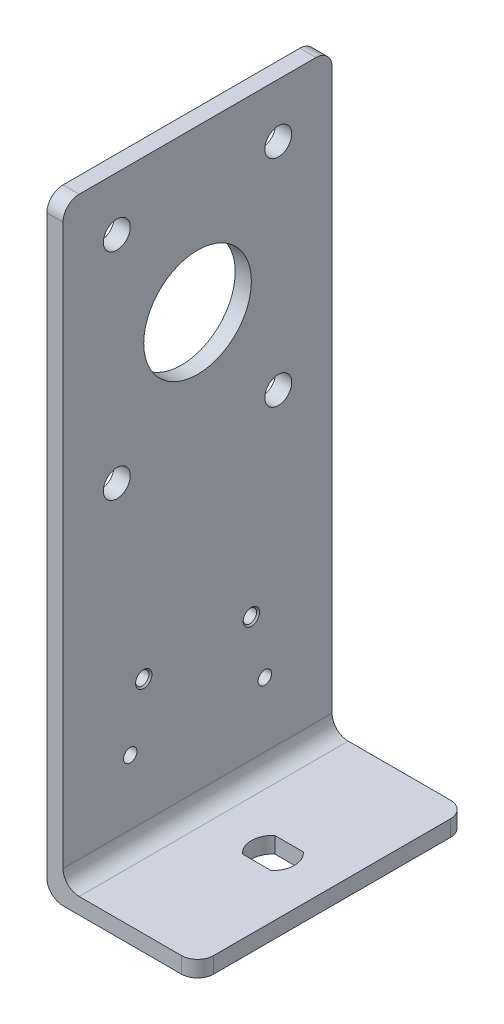
ISO-10303-21;
HEADER;
FILE_DESCRIPTION(('STEP AP214'),'2;1');
FILE_NAME('part.step','',(''),(''),'','','');
FILE_SCHEMA(('AUTOMOTIVE_DESIGN { 1 0 10303 214 1 1 1 1 }'));
ENDSEC;
DATA;
#1=APPLICATION_CONTEXT('core data for automotive mechanical design processes');
#2=APPLICATION_PROTOCOL_DEFINITION('international standard','automotive_design',2000,#1);
#3=PRODUCT_CONTEXT('',#1,'mechanical');
#4=PRODUCT('Part','Part','',(#3));
#5=PRODUCT_RELATED_PRODUCT_CATEGORY('part','',(#4));
#6=PRODUCT_DEFINITION_FORMATION('','',#4);
#7=PRODUCT_DEFINITION_CONTEXT('part definition',#1,'design');
#8=PRODUCT_DEFINITION('design','',#6,#7);
#9=PRODUCT_DEFINITION_SHAPE('','',#8);
#10=(LENGTH_UNIT() NAMED_UNIT(*) SI_UNIT(.MILLI.,.METRE.));
#11=(NAMED_UNIT(*) PLANE_ANGLE_UNIT() SI_UNIT($,.RADIAN.));
#12=(NAMED_UNIT(*) SI_UNIT($,.STERADIAN.) SOLID_ANGLE_UNIT());
#13=UNCERTAINTY_MEASURE_WITH_UNIT(LENGTH_MEASURE(1.E-05),#10,'distance_accuracy_value','');
#14=(GEOMETRIC_REPRESENTATION_CONTEXT(3) GLOBAL_UNCERTAINTY_ASSIGNED_CONTEXT((#13)) GLOBAL_UNIT_ASSIGNED_CONTEXT((#10,
#11,#12)) REPRESENTATION_CONTEXT('',''));
#15=CARTESIAN_POINT('',(0.,0.,0.));
#16=DIRECTION('',(0.,0.,1.));
#17=DIRECTION('',(1.,0.,0.));
#18=AXIS2_PLACEMENT_3D('',#15,#16,#17);
#19=CARTESIAN_POINT('',(0.,-3.,50.));
#20=DIRECTION('',(0.,1.,0.));
#21=DIRECTION('',(0.,0.,1.));
#22=AXIS2_PLACEMENT_3D('',#19,#20,#21);
#23=PLANE('',#22);
#24=DIRECTION('',(1.,0.,0.));
#25=VECTOR('',#24,1.);
#26=CARTESIAN_POINT('',(11.3542486889354,-3.,22.));
#27=LINE('',#26,#25);
#28=CARTESIAN_POINT('',(11.3542486889354,-3.,22.));
#29=VERTEX_POINT('',#28);
#30=CARTESIAN_POINT('',(16.6457513110646,-3.,22.));
#31=VERTEX_POINT('',#30);
#32=EDGE_CURVE('E176',#29,#31,#27,.T.);
#33=ORIENTED_EDGE('',*,*,#32,.F.);
#34=CARTESIAN_POINT('',(14.,-3.,25.));
#35=DIRECTION('',(0.,-1.,0.));
#36=DIRECTION('',(0.,0.,-1.));
#37=AXIS2_PLACEMENT_3D('',#34,#35,#36);
#38=CIRCLE('',#37,4.);
#39=CARTESIAN_POINT('',(11.3542486889354,-3.,28.));
#40=VERTEX_POINT('',#39);
#41=EDGE_CURVE('E181',#40,#29,#38,.T.);
#42=ORIENTED_EDGE('',*,*,#41,.F.);
#43=DIRECTION('',(1.,0.,0.));
#44=VECTOR('',#43,1.);
#45=CARTESIAN_POINT('',(11.3542486889354,-3.,28.));
#46=LINE('',#45,#44);
#47=CARTESIAN_POINT('',(16.6457513110646,-3.,28.));
#48=VERTEX_POINT('',#47);
#49=EDGE_CURVE('E185',#40,#48,#46,.T.);
#50=ORIENTED_EDGE('',*,*,#49,.T.);
#51=CARTESIAN_POINT('',(14.,-3.,25.));
#52=DIRECTION('',(0.,-1.,0.));
#53=DIRECTION('',(0.,0.,-1.));
#54=AXIS2_PLACEMENT_3D('',#51,#52,#53);
#55=CIRCLE('',#54,4.);
#56=EDGE_CURVE('E165',#31,#48,#55,.T.);
#57=ORIENTED_EDGE('',*,*,#56,.F.);
#58=EDGE_LOOP('',(#33,#42,#50,#57));
#59=FACE_BOUND('',#58,.T.);
#60=DIRECTION('',(1.,0.,0.));
#61=VECTOR('',#60,1.);
#62=CARTESIAN_POINT('',(0.,-3.,50.));
#63=LINE('',#62,#61);
#64=CARTESIAN_POINT('',(0.,-3.,50.));
#65=VERTEX_POINT('',#64);
#66=CARTESIAN_POINT('',(22.,-3.,50.));
#67=VERTEX_POINT('',#66);
#68=EDGE_CURVE('E239',#65,#67,#63,.T.);
#69=ORIENTED_EDGE('',*,*,#68,.F.);
#70=DIRECTION('',(0.,0.,-1.));
#71=VECTOR('',#70,1.);
#72=CARTESIAN_POINT('',(0.,-3.,50.));
#73=LINE('',#72,#71);
#74=CARTESIAN_POINT('',(0.,-3.,0.));
#75=VERTEX_POINT('',#74);
#76=EDGE_CURVE('E320',#65,#75,#73,.T.);
#77=ORIENTED_EDGE('',*,*,#76,.T.);
#78=DIRECTION('',(1.,0.,0.));
#79=VECTOR('',#78,1.);
#80=CARTESIAN_POINT('',(0.,-3.,0.));
#81=LINE('',#80,#79);
#82=CARTESIAN_POINT('',(22.,-3.,0.));
#83=VERTEX_POINT('',#82);
#84=EDGE_CURVE('E238',#75,#83,#81,.T.);
#85=ORIENTED_EDGE('',*,*,#84,.T.);
#86=CARTESIAN_POINT('',(22.,-3.,3.));
#87=DIRECTION('',(0.,1.,0.));
#88=DIRECTION('',(0.,0.,1.));
#89=AXIS2_PLACEMENT_3D('',#86,#87,#88);
#90=CIRCLE('',#89,3.);
#91=CARTESIAN_POINT('',(25.,-3.,3.));
#92=VERTEX_POINT('',#91);
#93=EDGE_CURVE('E286',#83,#92,#90,.F.);
#94=ORIENTED_EDGE('',*,*,#93,.T.);
#95=DIRECTION('',(0.,0.,-1.));
#96=VECTOR('',#95,1.);
#97=CARTESIAN_POINT('',(25.,-3.,50.));
#98=LINE('',#97,#96);
#99=CARTESIAN_POINT('',(25.,-3.,47.));
#100=VERTEX_POINT('',#99);
#101=EDGE_CURVE('E266',#100,#92,#98,.T.);
#102=ORIENTED_EDGE('',*,*,#101,.F.);
#103=CARTESIAN_POINT('',(22.,-3.,47.));
#104=DIRECTION('',(0.,1.,0.));
#105=DIRECTION('',(0.,0.,1.));
#106=AXIS2_PLACEMENT_3D('',#103,#104,#105);
#107=CIRCLE('',#106,3.);
#108=EDGE_CURVE('E288',#100,#67,#107,.F.);
#109=ORIENTED_EDGE('',*,*,#108,.T.);
#110=EDGE_LOOP('',(#69,#77,#85,#94,#102,#109));
#111=FACE_BOUND('',#110,.T.);
#112=ADVANCED_FACE('F49',(#59,#111),#23,.F.);
#113=CARTESIAN_POINT('',(25.,0.,50.));
#114=DIRECTION('',(1.,0.,0.));
#115=DIRECTION('',(0.,0.,-1.));
#116=AXIS2_PLACEMENT_3D('',#113,#114,#115);
#117=PLANE('',#116);
#118=DIRECTION('',(0.,0.,-1.));
#119=VECTOR('',#118,1.);
#120=CARTESIAN_POINT('',(25.,0.,50.));
#121=LINE('',#120,#119);
#122=CARTESIAN_POINT('',(25.,0.,47.));
#123=VERTEX_POINT('',#122);
#124=CARTESIAN_POINT('',(25.,0.,3.));
#125=VERTEX_POINT('',#124);
#126=EDGE_CURVE('E263',#123,#125,#121,.T.);
#127=ORIENTED_EDGE('',*,*,#126,.F.);
#128=DIRECTION('',(0.,-1.,0.));
#129=VECTOR('',#128,1.);
#130=CARTESIAN_POINT('',(25.,-3.,47.));
#131=LINE('',#130,#129);
#132=EDGE_CURVE('E283',#123,#100,#131,.T.);
#133=ORIENTED_EDGE('',*,*,#132,.T.);
#134=ORIENTED_EDGE('',*,*,#101,.T.);
#135=DIRECTION('',(0.,-1.,0.));
#136=VECTOR('',#135,1.);
#137=CARTESIAN_POINT('',(25.,0.,3.));
#138=LINE('',#137,#136);
#139=EDGE_CURVE('E281',#92,#125,#138,.F.);
#140=ORIENTED_EDGE('',*,*,#139,.T.);
#141=EDGE_LOOP('',(#127,#133,#134,#140));
#142=FACE_BOUND('',#141,.T.);
#143=ADVANCED_FACE('F376',(#142),#117,.T.);
#144=CARTESIAN_POINT('',(0.,0.,50.));
#145=DIRECTION('',(0.,1.,0.));
#146=DIRECTION('',(0.,0.,1.));
#147=AXIS2_PLACEMENT_3D('',#144,#145,#146);
#148=PLANE('',#147);
#149=CARTESIAN_POINT('',(14.,0.,25.));
#150=DIRECTION('',(0.,1.,0.));
#151=DIRECTION('',(0.,0.,1.));
#152=AXIS2_PLACEMENT_3D('',#149,#150,#151);
#153=CIRCLE('',#152,4.);
#154=CARTESIAN_POINT('',(11.3542486889354,0.,22.));
#155=VERTEX_POINT('',#154);
#156=CARTESIAN_POINT('',(11.3542486889354,0.,28.));
#157=VERTEX_POINT('',#156);
#158=EDGE_CURVE('E279',#155,#157,#153,.T.);
#159=ORIENTED_EDGE('',*,*,#158,.F.);
#160=DIRECTION('',(-1.,0.,0.));
#161=VECTOR('',#160,1.);
#162=CARTESIAN_POINT('',(0.,0.,22.));
#163=LINE('',#162,#161);
#164=CARTESIAN_POINT('',(16.6457513110646,0.,22.));
#165=VERTEX_POINT('',#164);
#166=EDGE_CURVE('E269',#165,#155,#163,.T.);
#167=ORIENTED_EDGE('',*,*,#166,.F.);
#168=CARTESIAN_POINT('',(14.,0.,25.));
#169=DIRECTION('',(0.,1.,0.));
#170=DIRECTION('',(0.,0.,1.));
#171=AXIS2_PLACEMENT_3D('',#168,#169,#170);
#172=CIRCLE('',#171,4.);
#173=CARTESIAN_POINT('',(16.6457513110646,0.,28.));
#174=VERTEX_POINT('',#173);
#175=EDGE_CURVE('E168',#174,#165,#172,.T.);
#176=ORIENTED_EDGE('',*,*,#175,.F.);
#177=DIRECTION('',(-1.,0.,0.));
#178=VECTOR('',#177,1.);
#179=CARTESIAN_POINT('',(0.,0.,28.));
#180=LINE('',#179,#178);
#181=EDGE_CURVE('E276',#174,#157,#180,.T.);
#182=ORIENTED_EDGE('',*,*,#181,.T.);
#183=EDGE_LOOP('',(#159,#167,#176,#182));
#184=FACE_BOUND('',#183,.T.);
#185=DIRECTION('',(1.,0.,0.));
#186=VECTOR('',#185,1.);
#187=CARTESIAN_POINT('',(0.,0.,0.));
#188=LINE('',#187,#186);
#189=CARTESIAN_POINT('',(3.,0.,0.));
#190=VERTEX_POINT('',#189);
#191=CARTESIAN_POINT('',(22.,0.,0.));
#192=VERTEX_POINT('',#191);
#193=EDGE_CURVE('E252',#190,#192,#188,.T.);
#194=ORIENTED_EDGE('',*,*,#193,.F.);
#195=DIRECTION('',(0.,0.,-1.));
#196=VECTOR('',#195,1.);
#197=CARTESIAN_POINT('',(3.,0.,50.));
#198=LINE('',#197,#196);
#199=CARTESIAN_POINT('',(3.,0.,50.));
#200=VERTEX_POINT('',#199);
#201=EDGE_CURVE('E70',#190,#200,#198,.F.);
#202=ORIENTED_EDGE('',*,*,#201,.T.);
#203=DIRECTION('',(1.,0.,0.));
#204=VECTOR('',#203,1.);
#205=CARTESIAN_POINT('',(0.,0.,50.));
#206=LINE('',#205,#204);
#207=CARTESIAN_POINT('',(22.,0.,50.));
#208=VERTEX_POINT('',#207);
#209=EDGE_CURVE('E241',#200,#208,#206,.T.);
#210=ORIENTED_EDGE('',*,*,#209,.T.);
#211=CARTESIAN_POINT('',(22.,0.,47.));
#212=DIRECTION('',(0.,1.,0.));
#213=DIRECTION('',(0.,0.,1.));
#214=AXIS2_PLACEMENT_3D('',#211,#212,#213);
#215=CIRCLE('',#214,3.);
#216=EDGE_CURVE('E299',#208,#123,#215,.T.);
#217=ORIENTED_EDGE('',*,*,#216,.T.);
#218=ORIENTED_EDGE('',*,*,#126,.T.);
#219=CARTESIAN_POINT('',(22.,0.,3.));
#220=DIRECTION('',(0.,1.,0.));
#221=DIRECTION('',(0.,0.,1.));
#222=AXIS2_PLACEMENT_3D('',#219,#220,#221);
#223=CIRCLE('',#222,3.);
#224=EDGE_CURVE('E296',#125,#192,#223,.T.);
#225=ORIENTED_EDGE('',*,*,#224,.T.);
#226=EDGE_LOOP('',(#194,#202,#210,#217,#218,#225));
#227=FACE_BOUND('',#226,.T.);
#228=ADVANCED_FACE('F381',(#184,#227),#148,.T.);
#229=CARTESIAN_POINT('',(0.,110.,50.));
#230=DIRECTION('',(1.,0.,0.));
#231=DIRECTION('',(0.,1.,0.));
#232=AXIS2_PLACEMENT_3D('',#229,#230,#231);
#233=PLANE('',#232);
#234=CARTESIAN_POINT('',(0.,26.,35.));
#235=DIRECTION('',(1.,0.,0.));
#236=DIRECTION('',(0.,0.,-1.));
#237=AXIS2_PLACEMENT_3D('',#234,#235,#236);
#238=CIRCLE('',#237,1.525);
#239=CARTESIAN_POINT('',(0.,26.,33.475));
#240=VERTEX_POINT('',#239);
#241=EDGE_CURVE('E500',#240,#240,#238,.T.);
#242=ORIENTED_EDGE('',*,*,#241,.F.);
#243=EDGE_LOOP('',(#242));
#244=FACE_BOUND('',#243,.T.);
#245=CARTESIAN_POINT('',(0.,26.,15.));
#246=DIRECTION('',(1.,0.,0.));
#247=DIRECTION('',(0.,0.,-1.));
#248=AXIS2_PLACEMENT_3D('',#245,#246,#247);
#249=CIRCLE('',#248,1.525);
#250=CARTESIAN_POINT('',(0.,26.,13.475));
#251=VERTEX_POINT('',#250);
#252=EDGE_CURVE('E328',#251,#251,#249,.T.);
#253=ORIENTED_EDGE('',*,*,#252,.F.);
#254=EDGE_LOOP('',(#253));
#255=FACE_BOUND('',#254,.T.);
#256=CARTESIAN_POINT('',(0.,15.,12.5));
#257=DIRECTION('',(1.,0.,0.));
#258=DIRECTION('',(0.,1.,0.));
#259=AXIS2_PLACEMENT_3D('',#256,#257,#258);
#260=CIRCLE('',#259,1.25);
#261=CARTESIAN_POINT('',(0.,16.25,12.5));
#262=VERTEX_POINT('',#261);
#263=EDGE_CURVE('E200',#262,#262,#260,.T.);
#264=ORIENTED_EDGE('',*,*,#263,.F.);
#265=EDGE_LOOP('',(#264));
#266=FACE_BOUND('',#265,.T.);
#267=CARTESIAN_POINT('',(0.,15.,37.5));
#268=DIRECTION('',(1.,0.,0.));
#269=DIRECTION('',(0.,1.,0.));
#270=AXIS2_PLACEMENT_3D('',#267,#268,#269);
#271=CIRCLE('',#270,1.25);
#272=CARTESIAN_POINT('',(0.,16.25,37.5));
#273=VERTEX_POINT('',#272);
#274=EDGE_CURVE('E207',#273,#273,#271,.T.);
#275=ORIENTED_EDGE('',*,*,#274,.F.);
#276=EDGE_LOOP('',(#275));
#277=FACE_BOUND('',#276,.T.);
#278=CARTESIAN_POINT('',(0.,80.,25.));
#279=DIRECTION('',(1.,0.,0.));
#280=DIRECTION('',(0.,1.,0.));
#281=AXIS2_PLACEMENT_3D('',#278,#279,#280);
#282=CIRCLE('',#281,10.);
#283=CARTESIAN_POINT('',(0.,90.,25.));
#284=VERTEX_POINT('',#283);
#285=EDGE_CURVE('E211',#284,#284,#282,.T.);
#286=ORIENTED_EDGE('',*,*,#285,.F.);
#287=EDGE_LOOP('',(#286));
#288=FACE_BOUND('',#287,.T.);
#289=CARTESIAN_POINT('',(0.,100.,10.));
#290=DIRECTION('',(1.,0.,0.));
#291=DIRECTION('',(0.,1.,0.));
#292=AXIS2_PLACEMENT_3D('',#289,#290,#291);
#293=CIRCLE('',#292,2.50000000000002);
#294=CARTESIAN_POINT('',(0.,102.5,10.));
#295=VERTEX_POINT('',#294);
#296=EDGE_CURVE('E217',#295,#295,#293,.T.);
#297=ORIENTED_EDGE('',*,*,#296,.F.);
#298=EDGE_LOOP('',(#297));
#299=FACE_BOUND('',#298,.T.);
#300=CARTESIAN_POINT('',(0.,100.,40.));
#301=DIRECTION('',(1.,0.,0.));
#302=DIRECTION('',(0.,1.,0.));
#303=AXIS2_PLACEMENT_3D('',#300,#301,#302);
#304=CIRCLE('',#303,2.50000000000002);
#305=CARTESIAN_POINT('',(0.,102.5,40.));
#306=VERTEX_POINT('',#305);
#307=EDGE_CURVE('E223',#306,#306,#304,.T.);
#308=ORIENTED_EDGE('',*,*,#307,.F.);
#309=EDGE_LOOP('',(#308));
#310=FACE_BOUND('',#309,.T.);
#311=CARTESIAN_POINT('',(0.,60.,40.));
#312=DIRECTION('',(1.,0.,0.));
#313=DIRECTION('',(0.,1.,0.));
#314=AXIS2_PLACEMENT_3D('',#311,#312,#313);
#315=CIRCLE('',#314,2.50000000000001);
#316=CARTESIAN_POINT('',(0.,62.5,40.));
#317=VERTEX_POINT('',#316);
#318=EDGE_CURVE('E229',#317,#317,#315,.T.);
#319=ORIENTED_EDGE('',*,*,#318,.F.);
#320=EDGE_LOOP('',(#319));
#321=FACE_BOUND('',#320,.T.);
#322=CARTESIAN_POINT('',(0.,60.,10.));
#323=DIRECTION('',(1.,0.,0.));
#324=DIRECTION('',(0.,1.,0.));
#325=AXIS2_PLACEMENT_3D('',#322,#323,#324);
#326=CIRCLE('',#325,2.50000000000001);
#327=CARTESIAN_POINT('',(0.,62.5,10.));
#328=VERTEX_POINT('',#327);
#329=EDGE_CURVE('E235',#328,#328,#326,.T.);
#330=ORIENTED_EDGE('',*,*,#329,.F.);
#331=EDGE_LOOP('',(#330));
#332=FACE_BOUND('',#331,.T.);
#333=DIRECTION('',(0.,-1.,0.));
#334=VECTOR('',#333,1.);
#335=CARTESIAN_POINT('',(0.,110.,50.));
#336=LINE('',#335,#334);
#337=CARTESIAN_POINT('',(0.,107.,50.));
#338=VERTEX_POINT('',#337);
#339=CARTESIAN_POINT('',(0.,3.,50.));
#340=VERTEX_POINT('',#339);
#341=EDGE_CURVE('E244',#338,#340,#336,.T.);
#342=ORIENTED_EDGE('',*,*,#341,.T.);
#343=DIRECTION('',(0.,0.,-1.));
#344=VECTOR('',#343,1.);
#345=CARTESIAN_POINT('',(0.,3.,0.));
#346=LINE('',#345,#344);
#347=CARTESIAN_POINT('',(0.,3.,0.));
#348=VERTEX_POINT('',#347);
#349=EDGE_CURVE('E338',#340,#348,#346,.T.);
#350=ORIENTED_EDGE('',*,*,#349,.T.);
#351=DIRECTION('',(0.,-1.,0.));
#352=VECTOR('',#351,1.);
#353=CARTESIAN_POINT('',(0.,110.,0.));
#354=LINE('',#353,#352);
#355=CARTESIAN_POINT('',(0.,107.,0.));
#356=VERTEX_POINT('',#355);
#357=EDGE_CURVE('E254',#356,#348,#354,.T.);
#358=ORIENTED_EDGE('',*,*,#357,.F.);
#359=CARTESIAN_POINT('',(0.,107.,3.));
#360=DIRECTION('',(1.,0.,0.));
#361=DIRECTION('',(0.,1.,0.));
#362=AXIS2_PLACEMENT_3D('',#359,#360,#361);
#363=CIRCLE('',#362,3.);
#364=CARTESIAN_POINT('',(0.,110.,3.));
#365=VERTEX_POINT('',#364);
#366=EDGE_CURVE('E309',#356,#365,#363,.T.);
#367=ORIENTED_EDGE('',*,*,#366,.T.);
#368=DIRECTION('',(0.,0.,-1.));
#369=VECTOR('',#368,1.);
#370=CARTESIAN_POINT('',(0.,110.,50.));
#371=LINE('',#370,#369);
#372=CARTESIAN_POINT('',(0.,110.,47.));
#373=VERTEX_POINT('',#372);
#374=EDGE_CURVE('E260',#373,#365,#371,.T.);
#375=ORIENTED_EDGE('',*,*,#374,.F.);
#376=CARTESIAN_POINT('',(0.,107.,47.));
#377=DIRECTION('',(1.,0.,0.));
#378=DIRECTION('',(0.,1.,0.));
#379=AXIS2_PLACEMENT_3D('',#376,#377,#378);
#380=CIRCLE('',#379,3.);
#381=EDGE_CURVE('E307',#373,#338,#380,.T.);
#382=ORIENTED_EDGE('',*,*,#381,.T.);
#383=EDGE_LOOP('',(#342,#350,#358,#367,#375,#382));
#384=FACE_BOUND('',#383,.T.);
#385=ADVANCED_FACE('F344',(#244,#255,#266,#277,#288,#299,#310,#321,#332,#384),#233,.T.);
#386=CARTESIAN_POINT('',(-3.00000000000001,110.,50.));
#387=DIRECTION('',(0.,1.,0.));
#388=DIRECTION('',(0.,0.,1.));
#389=AXIS2_PLACEMENT_3D('',#386,#387,#388);
#390=PLANE('',#389);
#391=ORIENTED_EDGE('',*,*,#374,.T.);
#392=DIRECTION('',(1.,0.,0.));
#393=VECTOR('',#392,1.);
#394=CARTESIAN_POINT('',(-3.00000000000001,110.,3.));
#395=LINE('',#394,#393);
#396=CARTESIAN_POINT('',(-3.00000000000001,110.,3.));
#397=VERTEX_POINT('',#396);
#398=EDGE_CURVE('E314',#365,#397,#395,.F.);
#399=ORIENTED_EDGE('',*,*,#398,.T.);
#400=DIRECTION('',(0.,0.,-1.));
#401=VECTOR('',#400,1.);
#402=CARTESIAN_POINT('',(-3.00000000000001,110.,50.));
#403=LINE('',#402,#401);
#404=CARTESIAN_POINT('',(-3.00000000000001,110.,47.));
#405=VERTEX_POINT('',#404);
#406=EDGE_CURVE('E250',#405,#397,#403,.T.);
#407=ORIENTED_EDGE('',*,*,#406,.F.);
#408=DIRECTION('',(1.,0.,0.));
#409=VECTOR('',#408,1.);
#410=CARTESIAN_POINT('',(0.,110.,47.));
#411=LINE('',#410,#409);
#412=EDGE_CURVE('E311',#405,#373,#411,.T.);
#413=ORIENTED_EDGE('',*,*,#412,.T.);
#414=EDGE_LOOP('',(#391,#399,#407,#413));
#415=FACE_BOUND('',#414,.T.);
#416=ADVANCED_FACE('F358',(#415),#390,.T.);
#417=CARTESIAN_POINT('',(-3.00000000000001,110.,50.));
#418=DIRECTION('',(1.,0.,0.));
#419=DIRECTION('',(0.,1.,0.));
#420=AXIS2_PLACEMENT_3D('',#417,#418,#419);
#421=PLANE('',#420);
#422=CARTESIAN_POINT('',(-3.,26.,35.));
#423=DIRECTION('',(1.,0.,0.));
#424=DIRECTION('',(0.,1.,0.));
#425=AXIS2_PLACEMENT_3D('',#422,#423,#424);
#426=CIRCLE('',#425,1.25);
#427=CARTESIAN_POINT('',(-3.,27.25,35.));
#428=VERTEX_POINT('',#427);
#429=EDGE_CURVE('E325',#428,#428,#426,.T.);
#430=ORIENTED_EDGE('',*,*,#429,.T.);
#431=EDGE_LOOP('',(#430));
#432=FACE_BOUND('',#431,.T.);
#433=CARTESIAN_POINT('',(-3.,26.,15.));
#434=DIRECTION('',(1.,0.,0.));
#435=DIRECTION('',(0.,1.,0.));
#436=AXIS2_PLACEMENT_3D('',#433,#434,#435);
#437=CIRCLE('',#436,1.25);
#438=CARTESIAN_POINT('',(-3.,27.25,15.));
#439=VERTEX_POINT('',#438);
#440=EDGE_CURVE('E321',#439,#439,#437,.T.);
#441=ORIENTED_EDGE('',*,*,#440,.T.);
#442=EDGE_LOOP('',(#441));
#443=FACE_BOUND('',#442,.T.);
#444=CARTESIAN_POINT('',(-3.,15.,12.5));
#445=DIRECTION('',(-1.,0.,0.));
#446=DIRECTION('',(0.,0.,1.));
#447=AXIS2_PLACEMENT_3D('',#444,#445,#446);
#448=CIRCLE('',#447,1.525);
#449=CARTESIAN_POINT('',(-3.,15.,14.025));
#450=VERTEX_POINT('',#449);
#451=EDGE_CURVE('E192',#450,#450,#448,.T.);
#452=ORIENTED_EDGE('',*,*,#451,.F.);
#453=EDGE_LOOP('',(#452));
#454=FACE_BOUND('',#453,.T.);
#455=CARTESIAN_POINT('',(-3.,15.,37.5));
#456=DIRECTION('',(-1.,0.,0.));
#457=DIRECTION('',(0.,0.,1.));
#458=AXIS2_PLACEMENT_3D('',#455,#456,#457);
#459=CIRCLE('',#458,1.525);
#460=CARTESIAN_POINT('',(-3.,15.,39.025));
#461=VERTEX_POINT('',#460);
#462=EDGE_CURVE('E201',#461,#461,#459,.T.);
#463=ORIENTED_EDGE('',*,*,#462,.F.);
#464=EDGE_LOOP('',(#463));
#465=FACE_BOUND('',#464,.T.);
#466=CARTESIAN_POINT('',(-3.00000000000001,80.,25.));
#467=DIRECTION('',(-1.,0.,0.));
#468=DIRECTION('',(0.,-1.,0.));
#469=AXIS2_PLACEMENT_3D('',#466,#467,#468);
#470=CIRCLE('',#469,10.);
#471=CARTESIAN_POINT('',(-3.00000000000001,70.,25.));
#472=VERTEX_POINT('',#471);
#473=EDGE_CURVE('E208',#472,#472,#470,.T.);
#474=ORIENTED_EDGE('',*,*,#473,.F.);
#475=EDGE_LOOP('',(#474));
#476=FACE_BOUND('',#475,.T.);
#477=CARTESIAN_POINT('',(-3.00000000000001,100.,10.));
#478=DIRECTION('',(-1.,0.,0.));
#479=DIRECTION('',(0.,0.,1.));
#480=AXIS2_PLACEMENT_3D('',#477,#478,#479);
#481=CIRCLE('',#480,2.50000000000002);
#482=CARTESIAN_POINT('',(-3.00000000000001,100.,12.5));
#483=VERTEX_POINT('',#482);
#484=EDGE_CURVE('E214',#483,#483,#481,.T.);
#485=ORIENTED_EDGE('',*,*,#484,.F.);
#486=EDGE_LOOP('',(#485));
#487=FACE_BOUND('',#486,.T.);
#488=CARTESIAN_POINT('',(-3.00000000000001,100.,40.));
#489=DIRECTION('',(-1.,0.,0.));
#490=DIRECTION('',(0.,0.,1.));
#491=AXIS2_PLACEMENT_3D('',#488,#489,#490);
#492=CIRCLE('',#491,2.50000000000002);
#493=CARTESIAN_POINT('',(-3.00000000000001,100.,42.5));
#494=VERTEX_POINT('',#493);
#495=EDGE_CURVE('E220',#494,#494,#492,.T.);
#496=ORIENTED_EDGE('',*,*,#495,.F.);
#497=EDGE_LOOP('',(#496));
#498=FACE_BOUND('',#497,.T.);
#499=CARTESIAN_POINT('',(-3.00000000000001,60.,40.));
#500=DIRECTION('',(-1.,0.,0.));
#501=DIRECTION('',(0.,0.,1.));
#502=AXIS2_PLACEMENT_3D('',#499,#500,#501);
#503=CIRCLE('',#502,2.50000000000001);
#504=CARTESIAN_POINT('',(-3.00000000000001,60.,42.5));
#505=VERTEX_POINT('',#504);
#506=EDGE_CURVE('E226',#505,#505,#503,.T.);
#507=ORIENTED_EDGE('',*,*,#506,.F.);
#508=EDGE_LOOP('',(#507));
#509=FACE_BOUND('',#508,.T.);
#510=CARTESIAN_POINT('',(-3.00000000000001,60.,10.));
#511=DIRECTION('',(-1.,0.,0.));
#512=DIRECTION('',(0.,0.,1.));
#513=AXIS2_PLACEMENT_3D('',#510,#511,#512);
#514=CIRCLE('',#513,2.50000000000001);
#515=CARTESIAN_POINT('',(-3.00000000000001,60.,12.5));
#516=VERTEX_POINT('',#515);
#517=EDGE_CURVE('E232',#516,#516,#514,.T.);
#518=ORIENTED_EDGE('',*,*,#517,.F.);
#519=EDGE_LOOP('',(#518));
#520=FACE_BOUND('',#519,.T.);
#521=DIRECTION('',(0.,-1.,0.));
#522=VECTOR('',#521,1.);
#523=CARTESIAN_POINT('',(-3.00000000000001,110.,0.));
#524=LINE('',#523,#522);
#525=CARTESIAN_POINT('',(-3.00000000000001,107.,0.));
#526=VERTEX_POINT('',#525);
#527=CARTESIAN_POINT('',(-3.,0.,0.));
#528=VERTEX_POINT('',#527);
#529=EDGE_CURVE('E242',#526,#528,#524,.T.);
#530=ORIENTED_EDGE('',*,*,#529,.T.);
#531=DIRECTION('',(0.,0.,-1.));
#532=VECTOR('',#531,1.);
#533=CARTESIAN_POINT('',(-3.,0.,50.));
#534=LINE('',#533,#532);
#535=CARTESIAN_POINT('',(-3.,0.,50.));
#536=VERTEX_POINT('',#535);
#537=EDGE_CURVE('E334',#528,#536,#534,.F.);
#538=ORIENTED_EDGE('',*,*,#537,.T.);
#539=DIRECTION('',(0.,-1.,0.));
#540=VECTOR('',#539,1.);
#541=CARTESIAN_POINT('',(-3.00000000000001,110.,50.));
#542=LINE('',#541,#540);
#543=CARTESIAN_POINT('',(-3.00000000000001,107.,50.));
#544=VERTEX_POINT('',#543);
#545=EDGE_CURVE('E247',#544,#536,#542,.T.);
#546=ORIENTED_EDGE('',*,*,#545,.F.);
#547=CARTESIAN_POINT('',(-3.00000000000001,107.,47.));
#548=DIRECTION('',(1.,0.,0.));
#549=DIRECTION('',(0.,1.,0.));
#550=AXIS2_PLACEMENT_3D('',#547,#548,#549);
#551=CIRCLE('',#550,3.);
#552=EDGE_CURVE('E316',#544,#405,#551,.F.);
#553=ORIENTED_EDGE('',*,*,#552,.T.);
#554=ORIENTED_EDGE('',*,*,#406,.T.);
#555=CARTESIAN_POINT('',(-3.00000000000001,107.,3.));
#556=DIRECTION('',(1.,0.,0.));
#557=DIRECTION('',(0.,1.,0.));
#558=AXIS2_PLACEMENT_3D('',#555,#556,#557);
#559=CIRCLE('',#558,3.);
#560=EDGE_CURVE('E318',#397,#526,#559,.F.);
#561=ORIENTED_EDGE('',*,*,#560,.T.);
#562=EDGE_LOOP('',(#530,#538,#546,#553,#554,#561));
#563=FACE_BOUND('',#562,.T.);
#564=ADVANCED_FACE('F464',(#432,#443,#454,#465,#476,#487,#498,#509,#520,#563),#421,.F.);
#565=CARTESIAN_POINT('',(0.,0.,50.));
#566=DIRECTION('',(0.,0.,-1.));
#567=DIRECTION('',(-1.,0.,0.));
#568=AXIS2_PLACEMENT_3D('',#565,#566,#567);
#569=PLANE('',#568);
#570=ORIENTED_EDGE('',*,*,#545,.T.);
#571=CARTESIAN_POINT('',(0.,0.,50.));
#572=DIRECTION('',(0.,0.,-1.));
#573=DIRECTION('',(-1.,0.,0.));
#574=AXIS2_PLACEMENT_3D('',#571,#572,#573);
#575=CIRCLE('',#574,3.);
#576=EDGE_CURVE('E336',#536,#65,#575,.F.);
#577=ORIENTED_EDGE('',*,*,#576,.T.);
#578=ORIENTED_EDGE('',*,*,#68,.T.);
#579=DIRECTION('',(0.,-1.,0.));
#580=VECTOR('',#579,1.);
#581=CARTESIAN_POINT('',(22.,0.,50.));
#582=LINE('',#581,#580);
#583=EDGE_CURVE('E293',#67,#208,#582,.F.);
#584=ORIENTED_EDGE('',*,*,#583,.T.);
#585=ORIENTED_EDGE('',*,*,#209,.F.);
#586=CARTESIAN_POINT('',(3.,3.,50.));
#587=DIRECTION('',(0.,0.,-1.));
#588=DIRECTION('',(-1.,0.,0.));
#589=AXIS2_PLACEMENT_3D('',#586,#587,#588);
#590=CIRCLE('',#589,3.);
#591=EDGE_CURVE('E13',#200,#340,#590,.T.);
#592=ORIENTED_EDGE('',*,*,#591,.T.);
#593=ORIENTED_EDGE('',*,*,#341,.F.);
#594=DIRECTION('',(1.,0.,0.));
#595=VECTOR('',#594,1.);
#596=CARTESIAN_POINT('',(-3.00000000000001,107.,50.));
#597=LINE('',#596,#595);
#598=EDGE_CURVE('E291',#338,#544,#597,.F.);
#599=ORIENTED_EDGE('',*,*,#598,.T.);
#600=EDGE_LOOP('',(#570,#577,#578,#584,#585,#592,#593,#599));
#601=FACE_BOUND('',#600,.T.);
#602=ADVANCED_FACE('F366',(#601),#569,.F.);
#603=CARTESIAN_POINT('',(0.,0.,0.));
#604=DIRECTION('',(0.,0.,-1.));
#605=DIRECTION('',(-1.,0.,0.));
#606=AXIS2_PLACEMENT_3D('',#603,#604,#605);
#607=PLANE('',#606);
#608=ORIENTED_EDGE('',*,*,#84,.F.);
#609=CARTESIAN_POINT('',(0.,0.,0.));
#610=DIRECTION('',(0.,0.,-1.));
#611=DIRECTION('',(-1.,0.,0.));
#612=AXIS2_PLACEMENT_3D('',#609,#610,#611);
#613=CIRCLE('',#612,3.);
#614=EDGE_CURVE('E332',#75,#528,#613,.T.);
#615=ORIENTED_EDGE('',*,*,#614,.T.);
#616=ORIENTED_EDGE('',*,*,#529,.F.);
#617=DIRECTION('',(1.,0.,0.));
#618=VECTOR('',#617,1.);
#619=CARTESIAN_POINT('',(0.,107.,0.));
#620=LINE('',#619,#618);
#621=EDGE_CURVE('E301',#526,#356,#620,.T.);
#622=ORIENTED_EDGE('',*,*,#621,.T.);
#623=ORIENTED_EDGE('',*,*,#357,.T.);
#624=CARTESIAN_POINT('',(3.,3.,0.));
#625=DIRECTION('',(0.,0.,-1.));
#626=DIRECTION('',(-1.,0.,0.));
#627=AXIS2_PLACEMENT_3D('',#624,#625,#626);
#628=CIRCLE('',#627,3.);
#629=EDGE_CURVE('E57',#348,#190,#628,.F.);
#630=ORIENTED_EDGE('',*,*,#629,.T.);
#631=ORIENTED_EDGE('',*,*,#193,.T.);
#632=DIRECTION('',(0.,-1.,0.));
#633=VECTOR('',#632,1.);
#634=CARTESIAN_POINT('',(22.,0.,0.));
#635=LINE('',#634,#633);
#636=EDGE_CURVE('E304',#192,#83,#635,.T.);
#637=ORIENTED_EDGE('',*,*,#636,.T.);
#638=EDGE_LOOP('',(#608,#615,#616,#622,#623,#630,#631,#637));
#639=FACE_BOUND('',#638,.T.);
#640=ADVANCED_FACE('F349',(#639),#607,.T.);
#641=CARTESIAN_POINT('',(-3.00000000000001,60.,10.));
#642=DIRECTION('',(-1.,0.,0.));
#643=DIRECTION('',(0.,0.,1.));
#644=AXIS2_PLACEMENT_3D('',#641,#642,#643);
#645=CYLINDRICAL_SURFACE('',#644,2.50000000000001);
#646=ORIENTED_EDGE('',*,*,#329,.T.);
#647=EDGE_LOOP('',(#646));
#648=FACE_BOUND('',#647,.T.);
#649=ORIENTED_EDGE('',*,*,#517,.T.);
#650=EDGE_LOOP('',(#649));
#651=FACE_BOUND('',#650,.T.);
#652=ADVANCED_FACE('F457',(#648,#651),#645,.F.);
#653=CARTESIAN_POINT('',(-3.00000000000001,60.,40.));
#654=DIRECTION('',(-1.,0.,0.));
#655=DIRECTION('',(0.,0.,1.));
#656=AXIS2_PLACEMENT_3D('',#653,#654,#655);
#657=CYLINDRICAL_SURFACE('',#656,2.50000000000001);
#658=ORIENTED_EDGE('',*,*,#318,.T.);
#659=EDGE_LOOP('',(#658));
#660=FACE_BOUND('',#659,.T.);
#661=ORIENTED_EDGE('',*,*,#506,.T.);
#662=EDGE_LOOP('',(#661));
#663=FACE_BOUND('',#662,.T.);
#664=ADVANCED_FACE('F453',(#660,#663),#657,.F.);
#665=CARTESIAN_POINT('',(-3.00000000000001,100.,40.));
#666=DIRECTION('',(-1.,0.,0.));
#667=DIRECTION('',(0.,0.,1.));
#668=AXIS2_PLACEMENT_3D('',#665,#666,#667);
#669=CYLINDRICAL_SURFACE('',#668,2.50000000000002);
#670=ORIENTED_EDGE('',*,*,#307,.T.);
#671=EDGE_LOOP('',(#670));
#672=FACE_BOUND('',#671,.T.);
#673=ORIENTED_EDGE('',*,*,#495,.T.);
#674=EDGE_LOOP('',(#673));
#675=FACE_BOUND('',#674,.T.);
#676=ADVANCED_FACE('F449',(#672,#675),#669,.F.);
#677=CARTESIAN_POINT('',(-3.00000000000001,100.,10.));
#678=DIRECTION('',(-1.,0.,0.));
#679=DIRECTION('',(0.,0.,1.));
#680=AXIS2_PLACEMENT_3D('',#677,#678,#679);
#681=CYLINDRICAL_SURFACE('',#680,2.50000000000002);
#682=ORIENTED_EDGE('',*,*,#296,.T.);
#683=EDGE_LOOP('',(#682));
#684=FACE_BOUND('',#683,.T.);
#685=ORIENTED_EDGE('',*,*,#484,.T.);
#686=EDGE_LOOP('',(#685));
#687=FACE_BOUND('',#686,.T.);
#688=ADVANCED_FACE('F445',(#684,#687),#681,.F.);
#689=CARTESIAN_POINT('',(25.,80.,25.));
#690=DIRECTION('',(-1.,0.,0.));
#691=DIRECTION('',(0.,-1.,0.));
#692=AXIS2_PLACEMENT_3D('',#689,#690,#691);
#693=CYLINDRICAL_SURFACE('',#692,10.);
#694=ORIENTED_EDGE('',*,*,#285,.T.);
#695=EDGE_LOOP('',(#694));
#696=FACE_BOUND('',#695,.T.);
#697=ORIENTED_EDGE('',*,*,#473,.T.);
#698=EDGE_LOOP('',(#697));
#699=FACE_BOUND('',#698,.T.);
#700=ADVANCED_FACE('F441',(#696,#699),#693,.F.);
#701=CARTESIAN_POINT('',(-3.,15.,37.5));
#702=DIRECTION('',(-1.,0.,0.));
#703=DIRECTION('',(0.,0.,1.));
#704=AXIS2_PLACEMENT_3D('',#701,#702,#703);
#705=CYLINDRICAL_SURFACE('',#704,1.25);
#706=ORIENTED_EDGE('',*,*,#274,.T.);
#707=EDGE_LOOP('',(#706));
#708=FACE_BOUND('',#707,.T.);
#709=CARTESIAN_POINT('',(-2.725,15.,37.5));
#710=DIRECTION('',(-1.,0.,0.));
#711=DIRECTION('',(0.,0.,1.));
#712=AXIS2_PLACEMENT_3D('',#709,#710,#711);
#713=CIRCLE('',#712,1.25);
#714=CARTESIAN_POINT('',(-2.725,15.,38.75));
#715=VERTEX_POINT('',#714);
#716=EDGE_CURVE('E204',#715,#715,#713,.T.);
#717=ORIENTED_EDGE('',*,*,#716,.T.);
#718=EDGE_LOOP('',(#717));
#719=FACE_BOUND('',#718,.T.);
#720=ADVANCED_FACE('F437',(#708,#719),#705,.F.);
#721=CARTESIAN_POINT('',(-3.,15.,37.5));
#722=DIRECTION('',(-1.,0.,0.));
#723=DIRECTION('',(0.,0.,1.));
#724=AXIS2_PLACEMENT_3D('',#721,#722,#723);
#725=CONICAL_SURFACE('',#724,1.525,0.785398163397445);
#726=ORIENTED_EDGE('',*,*,#716,.F.);
#727=EDGE_LOOP('',(#726));
#728=FACE_BOUND('',#727,.T.);
#729=ORIENTED_EDGE('',*,*,#462,.T.);
#730=EDGE_LOOP('',(#729));
#731=FACE_BOUND('',#730,.T.);
#732=ADVANCED_FACE('F433',(#728,#731),#725,.F.);
#733=CARTESIAN_POINT('',(-3.,15.,12.5));
#734=DIRECTION('',(-1.,0.,0.));
#735=DIRECTION('',(0.,0.,1.));
#736=AXIS2_PLACEMENT_3D('',#733,#734,#735);
#737=CYLINDRICAL_SURFACE('',#736,1.25);
#738=ORIENTED_EDGE('',*,*,#263,.T.);
#739=EDGE_LOOP('',(#738));
#740=FACE_BOUND('',#739,.T.);
#741=CARTESIAN_POINT('',(-2.725,15.,12.5));
#742=DIRECTION('',(-1.,0.,0.));
#743=DIRECTION('',(0.,0.,1.));
#744=AXIS2_PLACEMENT_3D('',#741,#742,#743);
#745=CIRCLE('',#744,1.25);
#746=CARTESIAN_POINT('',(-2.725,15.,13.75));
#747=VERTEX_POINT('',#746);
#748=EDGE_CURVE('E197',#747,#747,#745,.T.);
#749=ORIENTED_EDGE('',*,*,#748,.T.);
#750=EDGE_LOOP('',(#749));
#751=FACE_BOUND('',#750,.T.);
#752=ADVANCED_FACE('F429',(#740,#751),#737,.F.);
#753=CARTESIAN_POINT('',(-3.,15.,12.5));
#754=DIRECTION('',(-1.,0.,0.));
#755=DIRECTION('',(0.,0.,1.));
#756=AXIS2_PLACEMENT_3D('',#753,#754,#755);
#757=CONICAL_SURFACE('',#756,1.525,0.785398163397445);
#758=ORIENTED_EDGE('',*,*,#748,.F.);
#759=EDGE_LOOP('',(#758));
#760=FACE_BOUND('',#759,.T.);
#761=ORIENTED_EDGE('',*,*,#451,.T.);
#762=EDGE_LOOP('',(#761));
#763=FACE_BOUND('',#762,.T.);
#764=ADVANCED_FACE('F425',(#760,#763),#757,.F.);
#765=CARTESIAN_POINT('',(14.,7.,25.));
#766=DIRECTION('',(0.,-1.,0.));
#767=DIRECTION('',(0.,0.,-1.));
#768=AXIS2_PLACEMENT_3D('',#765,#766,#767);
#769=CYLINDRICAL_SURFACE('',#768,4.);
#770=ORIENTED_EDGE('',*,*,#158,.T.);
#771=DIRECTION('',(0.,-1.,0.));
#772=VECTOR('',#771,1.);
#773=CARTESIAN_POINT('',(11.3542486889354,7.,28.));
#774=LINE('',#773,#772);
#775=EDGE_CURVE('E190',#157,#40,#774,.T.);
#776=ORIENTED_EDGE('',*,*,#775,.T.);
#777=ORIENTED_EDGE('',*,*,#41,.T.);
#778=DIRECTION('',(0.,-1.,0.));
#779=VECTOR('',#778,1.);
#780=CARTESIAN_POINT('',(11.3542486889354,7.,22.));
#781=LINE('',#780,#779);
#782=EDGE_CURVE('E172',#155,#29,#781,.T.);
#783=ORIENTED_EDGE('',*,*,#782,.F.);
#784=EDGE_LOOP('',(#770,#776,#777,#783));
#785=FACE_BOUND('',#784,.T.);
#786=ADVANCED_FACE('F417',(#785),#769,.F.);
#787=CARTESIAN_POINT('',(11.3542486889354,7.,28.));
#788=DIRECTION('',(0.,0.,-1.));
#789=DIRECTION('',(-1.,0.,0.));
#790=AXIS2_PLACEMENT_3D('',#787,#788,#789);
#791=PLANE('',#790);
#792=DIRECTION('',(0.,-1.,0.));
#793=VECTOR('',#792,1.);
#794=CARTESIAN_POINT('',(16.6457513110646,7.,28.));
#795=LINE('',#794,#793);
#796=EDGE_CURVE('E171',#174,#48,#795,.T.);
#797=ORIENTED_EDGE('',*,*,#796,.T.);
#798=ORIENTED_EDGE('',*,*,#49,.F.);
#799=ORIENTED_EDGE('',*,*,#775,.F.);
#800=ORIENTED_EDGE('',*,*,#181,.F.);
#801=EDGE_LOOP('',(#797,#798,#799,#800));
#802=FACE_BOUND('',#801,.T.);
#803=ADVANCED_FACE('F414',(#802),#791,.T.);
#804=CARTESIAN_POINT('',(14.,7.,25.));
#805=DIRECTION('',(0.,-1.,0.));
#806=DIRECTION('',(0.,0.,-1.));
#807=AXIS2_PLACEMENT_3D('',#804,#805,#806);
#808=CYLINDRICAL_SURFACE('',#807,4.);
#809=ORIENTED_EDGE('',*,*,#175,.T.);
#810=DIRECTION('',(0.,-1.,0.));
#811=VECTOR('',#810,1.);
#812=CARTESIAN_POINT('',(16.6457513110646,7.,22.));
#813=LINE('',#812,#811);
#814=EDGE_CURVE('E160',#165,#31,#813,.T.);
#815=ORIENTED_EDGE('',*,*,#814,.T.);
#816=ORIENTED_EDGE('',*,*,#56,.T.);
#817=ORIENTED_EDGE('',*,*,#796,.F.);
#818=EDGE_LOOP('',(#809,#815,#816,#817));
#819=FACE_BOUND('',#818,.T.);
#820=ADVANCED_FACE('F162',(#819),#808,.F.);
#821=CARTESIAN_POINT('',(11.3542486889354,7.,22.));
#822=DIRECTION('',(0.,0.,-1.));
#823=DIRECTION('',(-1.,0.,0.));
#824=AXIS2_PLACEMENT_3D('',#821,#822,#823);
#825=PLANE('',#824);
#826=ORIENTED_EDGE('',*,*,#166,.T.);
#827=ORIENTED_EDGE('',*,*,#782,.T.);
#828=ORIENTED_EDGE('',*,*,#32,.T.);
#829=ORIENTED_EDGE('',*,*,#814,.F.);
#830=EDGE_LOOP('',(#826,#827,#828,#829));
#831=FACE_BOUND('',#830,.T.);
#832=ADVANCED_FACE('F177',(#831),#825,.F.);
#833=CARTESIAN_POINT('',(22.,0.,47.));
#834=DIRECTION('',(0.,1.,0.));
#835=DIRECTION('',(0.,0.,1.));
#836=AXIS2_PLACEMENT_3D('',#833,#834,#835);
#837=CYLINDRICAL_SURFACE('',#836,3.);
#838=ORIENTED_EDGE('',*,*,#216,.F.);
#839=ORIENTED_EDGE('',*,*,#583,.F.);
#840=ORIENTED_EDGE('',*,*,#108,.F.);
#841=ORIENTED_EDGE('',*,*,#132,.F.);
#842=EDGE_LOOP('',(#838,#839,#840,#841));
#843=FACE_BOUND('',#842,.T.);
#844=ADVANCED_FACE('F386',(#843),#837,.T.);
#845=CARTESIAN_POINT('',(22.,0.,3.));
#846=DIRECTION('',(0.,-1.,0.));
#847=DIRECTION('',(0.,0.,-1.));
#848=AXIS2_PLACEMENT_3D('',#845,#846,#847);
#849=CYLINDRICAL_SURFACE('',#848,3.);
#850=ORIENTED_EDGE('',*,*,#224,.F.);
#851=ORIENTED_EDGE('',*,*,#139,.F.);
#852=ORIENTED_EDGE('',*,*,#93,.F.);
#853=ORIENTED_EDGE('',*,*,#636,.F.);
#854=EDGE_LOOP('',(#850,#851,#852,#853));
#855=FACE_BOUND('',#854,.T.);
#856=ADVANCED_FACE('F389',(#855),#849,.T.);
#857=CARTESIAN_POINT('',(0.,107.,3.));
#858=DIRECTION('',(1.,0.,0.));
#859=DIRECTION('',(0.,0.,-1.));
#860=AXIS2_PLACEMENT_3D('',#857,#858,#859);
#861=CYLINDRICAL_SURFACE('',#860,3.);
#862=ORIENTED_EDGE('',*,*,#560,.F.);
#863=ORIENTED_EDGE('',*,*,#398,.F.);
#864=ORIENTED_EDGE('',*,*,#366,.F.);
#865=ORIENTED_EDGE('',*,*,#621,.F.);
#866=EDGE_LOOP('',(#862,#863,#864,#865));
#867=FACE_BOUND('',#866,.T.);
#868=ADVANCED_FACE('F354',(#867),#861,.T.);
#869=CARTESIAN_POINT('',(-3.00000000000001,107.,47.));
#870=DIRECTION('',(-1.,0.,0.));
#871=DIRECTION('',(0.,0.,1.));
#872=AXIS2_PLACEMENT_3D('',#869,#870,#871);
#873=CYLINDRICAL_SURFACE('',#872,3.);
#874=ORIENTED_EDGE('',*,*,#552,.F.);
#875=ORIENTED_EDGE('',*,*,#598,.F.);
#876=ORIENTED_EDGE('',*,*,#381,.F.);
#877=ORIENTED_EDGE('',*,*,#412,.F.);
#878=EDGE_LOOP('',(#874,#875,#876,#877));
#879=FACE_BOUND('',#878,.T.);
#880=ADVANCED_FACE('F363',(#879),#873,.T.);
#881=CARTESIAN_POINT('',(0.,26.,15.));
#882=DIRECTION('',(1.,0.,0.));
#883=DIRECTION('',(0.,0.,-1.));
#884=AXIS2_PLACEMENT_3D('',#881,#882,#883);
#885=CYLINDRICAL_SURFACE('',#884,1.25);
#886=CARTESIAN_POINT('',(-0.275000000000011,26.,15.));
#887=DIRECTION('',(1.,0.,0.));
#888=DIRECTION('',(0.,0.,-1.));
#889=AXIS2_PLACEMENT_3D('',#886,#887,#888);
#890=CIRCLE('',#889,1.25);
#891=CARTESIAN_POINT('',(-0.275000000000011,26.,13.75));
#892=VERTEX_POINT('',#891);
#893=EDGE_CURVE('E324',#892,#892,#890,.T.);
#894=ORIENTED_EDGE('',*,*,#893,.T.);
#895=EDGE_LOOP('',(#894));
#896=FACE_BOUND('',#895,.T.);
#897=ORIENTED_EDGE('',*,*,#440,.F.);
#898=EDGE_LOOP('',(#897));
#899=FACE_BOUND('',#898,.T.);
#900=ADVANCED_FACE('F397',(#896,#899),#885,.F.);
#901=CARTESIAN_POINT('',(0.,26.,15.));
#902=DIRECTION('',(1.,0.,0.));
#903=DIRECTION('',(0.,0.,-1.));
#904=AXIS2_PLACEMENT_3D('',#901,#902,#903);
#905=CONICAL_SURFACE('',#904,1.525,0.785398163397445);
#906=ORIENTED_EDGE('',*,*,#893,.F.);
#907=EDGE_LOOP('',(#906));
#908=FACE_BOUND('',#907,.T.);
#909=ORIENTED_EDGE('',*,*,#252,.T.);
#910=EDGE_LOOP('',(#909));
#911=FACE_BOUND('',#910,.T.);
#912=ADVANCED_FACE('F401',(#908,#911),#905,.F.);
#913=CARTESIAN_POINT('',(0.,26.,35.));
#914=DIRECTION('',(1.,0.,0.));
#915=DIRECTION('',(0.,0.,-1.));
#916=AXIS2_PLACEMENT_3D('',#913,#914,#915);
#917=CYLINDRICAL_SURFACE('',#916,1.25);
#918=CARTESIAN_POINT('',(-0.275000000000011,26.,35.));
#919=DIRECTION('',(1.,0.,0.));
#920=DIRECTION('',(0.,0.,-1.));
#921=AXIS2_PLACEMENT_3D('',#918,#919,#920);
#922=CIRCLE('',#921,1.25);
#923=CARTESIAN_POINT('',(-0.275000000000011,26.,33.75));
#924=VERTEX_POINT('',#923);
#925=EDGE_CURVE('E329',#924,#924,#922,.T.);
#926=ORIENTED_EDGE('',*,*,#925,.T.);
#927=EDGE_LOOP('',(#926));
#928=FACE_BOUND('',#927,.T.);
#929=ORIENTED_EDGE('',*,*,#429,.F.);
#930=EDGE_LOOP('',(#929));
#931=FACE_BOUND('',#930,.T.);
#932=ADVANCED_FACE('F407',(#928,#931),#917,.F.);
#933=CARTESIAN_POINT('',(0.,26.,35.));
#934=DIRECTION('',(1.,0.,0.));
#935=DIRECTION('',(0.,0.,-1.));
#936=AXIS2_PLACEMENT_3D('',#933,#934,#935);
#937=CONICAL_SURFACE('',#936,1.525,0.785398163397445);
#938=ORIENTED_EDGE('',*,*,#925,.F.);
#939=EDGE_LOOP('',(#938));
#940=FACE_BOUND('',#939,.T.);
#941=ORIENTED_EDGE('',*,*,#241,.T.);
#942=EDGE_LOOP('',(#941));
#943=FACE_BOUND('',#942,.T.);
#944=ADVANCED_FACE('F373',(#940,#943),#937,.F.);
#945=CARTESIAN_POINT('',(0.,0.,50.));
#946=DIRECTION('',(0.,0.,-1.));
#947=DIRECTION('',(-1.,0.,0.));
#948=AXIS2_PLACEMENT_3D('',#945,#946,#947);
#949=CYLINDRICAL_SURFACE('',#948,3.);
#950=ORIENTED_EDGE('',*,*,#576,.F.);
#951=ORIENTED_EDGE('',*,*,#537,.F.);
#952=ORIENTED_EDGE('',*,*,#614,.F.);
#953=ORIENTED_EDGE('',*,*,#76,.F.);
#954=EDGE_LOOP('',(#950,#951,#952,#953));
#955=FACE_BOUND('',#954,.T.);
#956=ADVANCED_FACE('F369',(#955),#949,.T.);
#957=CARTESIAN_POINT('',(3.,3.,50.));
#958=DIRECTION('',(0.,0.,1.));
#959=DIRECTION('',(1.,0.,0.));
#960=AXIS2_PLACEMENT_3D('',#957,#958,#959);
#961=CYLINDRICAL_SURFACE('',#960,3.);
#962=ORIENTED_EDGE('',*,*,#591,.F.);
#963=ORIENTED_EDGE('',*,*,#201,.F.);
#964=ORIENTED_EDGE('',*,*,#629,.F.);
#965=ORIENTED_EDGE('',*,*,#349,.F.);
#966=EDGE_LOOP('',(#962,#963,#964,#965));
#967=FACE_BOUND('',#966,.T.);
#968=ADVANCED_FACE('F51',(#967),#961,.F.);
#969=CLOSED_SHELL('',(#112,#143,#228,#385,#416,#564,#602,#640,#652,#664,#676,#688,#700,#720,
#732,#752,#764,#786,#803,#820,#832,#844,#856,#868,#880,#900,#912,#932,#944,#956,#968));
#970=MANIFOLD_SOLID_BREP('B2',#969);
#971=ADVANCED_BREP_SHAPE_REPRESENTATION('',(#18,#970),#14);
#972=SHAPE_DEFINITION_REPRESENTATION(#9,#971);
ENDSEC;
END-ISO-10303-21;
